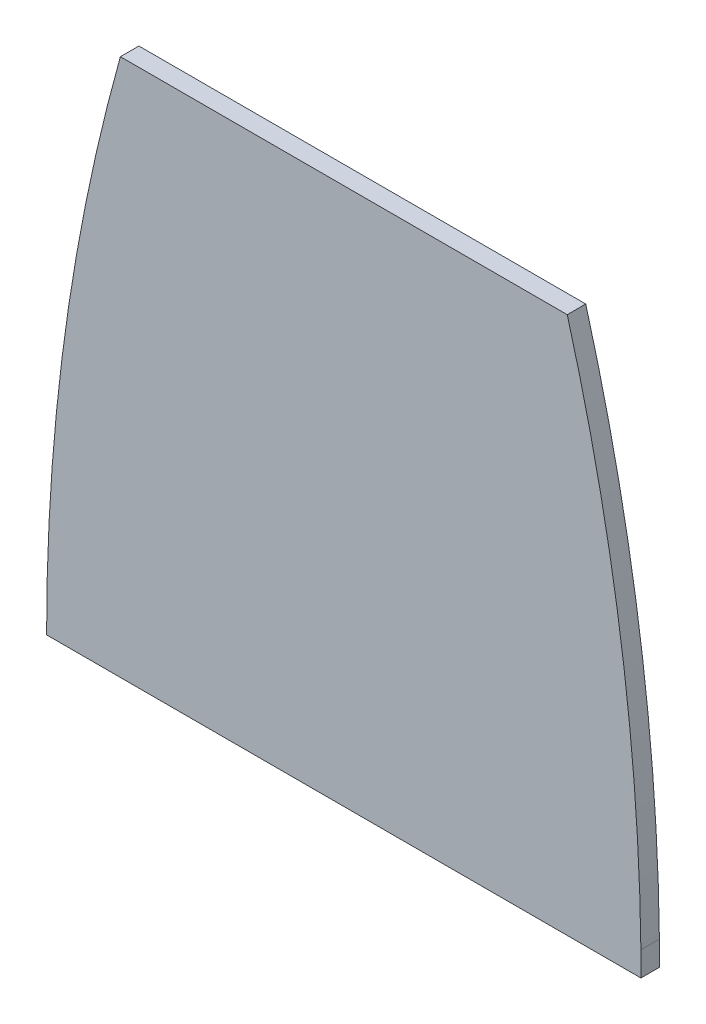
ISO-10303-21;
HEADER;
FILE_DESCRIPTION(('STEP AP214'),'2;1');
FILE_NAME('part.step','',(''),(''),'','','');
FILE_SCHEMA(('AUTOMOTIVE_DESIGN { 1 0 10303 214 1 1 1 1 }'));
ENDSEC;
DATA;
#1=APPLICATION_CONTEXT('core data for automotive mechanical design processes');
#2=APPLICATION_PROTOCOL_DEFINITION('international standard','automotive_design',2000,#1);
#3=PRODUCT_CONTEXT('',#1,'mechanical');
#4=PRODUCT('Part','Part','',(#3));
#5=PRODUCT_RELATED_PRODUCT_CATEGORY('part','',(#4));
#6=PRODUCT_DEFINITION_FORMATION('','',#4);
#7=PRODUCT_DEFINITION_CONTEXT('part definition',#1,'design');
#8=PRODUCT_DEFINITION('design','',#6,#7);
#9=PRODUCT_DEFINITION_SHAPE('','',#8);
#10=(LENGTH_UNIT() NAMED_UNIT(*) SI_UNIT(.MILLI.,.METRE.));
#11=(NAMED_UNIT(*) PLANE_ANGLE_UNIT() SI_UNIT($,.RADIAN.));
#12=(NAMED_UNIT(*) SI_UNIT($,.STERADIAN.) SOLID_ANGLE_UNIT());
#13=UNCERTAINTY_MEASURE_WITH_UNIT(LENGTH_MEASURE(1.E-05),#10,'distance_accuracy_value','');
#14=(GEOMETRIC_REPRESENTATION_CONTEXT(3) GLOBAL_UNCERTAINTY_ASSIGNED_CONTEXT((#13)) GLOBAL_UNIT_ASSIGNED_CONTEXT((#10,
#11,#12)) REPRESENTATION_CONTEXT('',''));
#15=CARTESIAN_POINT('',(0.,0.,0.));
#16=DIRECTION('',(0.,0.,1.));
#17=DIRECTION('',(1.,0.,0.));
#18=AXIS2_PLACEMENT_3D('',#15,#16,#17);
#19=CARTESIAN_POINT('',(275.39518676895,-43.5927780283153,3.));
#20=DIRECTION('',(0.,0.,-1.));
#21=DIRECTION('',(-1.,0.,0.));
#22=AXIS2_PLACEMENT_3D('',#19,#20,#21);
#23=CYLINDRICAL_SURFACE('',#22,323.583050847467);
#24=CARTESIAN_POINT('',(275.39518676895,-43.5927780283153,0.));
#25=DIRECTION('',(0.,0.,1.));
#26=DIRECTION('',(1.,0.,0.));
#27=AXIS2_PLACEMENT_3D('',#24,#25,#26);
#28=CIRCLE('',#27,323.583050847467);
#29=CARTESIAN_POINT('',(-36.2210349058072,43.5927780283133,0.));
#30=VERTEX_POINT('',#29);
#31=CARTESIAN_POINT('',(-48.187864078518,-43.5927780283133,0.));
#32=VERTEX_POINT('',#31);
#33=EDGE_CURVE('E123',#30,#32,#28,.T.);
#34=ORIENTED_EDGE('',*,*,#33,.T.);
#35=DIRECTION('',(0.,0.,-1.));
#36=VECTOR('',#35,1.);
#37=CARTESIAN_POINT('',(-48.187864078518,-43.5927780283133,3.));
#38=LINE('',#37,#36);
#39=CARTESIAN_POINT('',(-48.187864078518,-43.5927780283133,3.));
#40=VERTEX_POINT('',#39);
#41=EDGE_CURVE('E11',#40,#32,#38,.T.);
#42=ORIENTED_EDGE('',*,*,#41,.F.);
#43=CARTESIAN_POINT('',(275.39518676895,-43.5927780283153,3.));
#44=DIRECTION('',(0.,0.,1.));
#45=DIRECTION('',(1.,0.,0.));
#46=AXIS2_PLACEMENT_3D('',#43,#44,#45);
#47=CIRCLE('',#46,323.583050847467);
#48=CARTESIAN_POINT('',(-36.2210349058072,43.5927780283133,3.));
#49=VERTEX_POINT('',#48);
#50=EDGE_CURVE('E138',#49,#40,#47,.T.);
#51=ORIENTED_EDGE('',*,*,#50,.F.);
#52=DIRECTION('',(0.,0.,-1.));
#53=VECTOR('',#52,1.);
#54=CARTESIAN_POINT('',(-36.2210349058072,43.5927780283133,3.));
#55=LINE('',#54,#53);
#56=EDGE_CURVE('E60',#49,#30,#55,.T.);
#57=ORIENTED_EDGE('',*,*,#56,.T.);
#58=EDGE_LOOP('',(#34,#42,#51,#57));
#59=FACE_BOUND('',#58,.T.);
#60=ADVANCED_FACE('F43',(#59),#23,.T.);
#61=CARTESIAN_POINT('',(-48.187864078518,-43.5927780283133,3.));
#62=DIRECTION('',(0.,1.,0.));
#63=DIRECTION('',(0.,0.,1.));
#64=AXIS2_PLACEMENT_3D('',#61,#62,#63);
#65=PLANE('',#64);
#66=DIRECTION('',(1.,0.,0.));
#67=VECTOR('',#66,1.);
#68=CARTESIAN_POINT('',(-48.187864078518,-43.5927780283133,0.));
#69=LINE('',#68,#67);
#70=CARTESIAN_POINT('',(48.187864078518,-43.5927780283133,0.));
#71=VERTEX_POINT('',#70);
#72=EDGE_CURVE('E126',#32,#71,#69,.T.);
#73=ORIENTED_EDGE('',*,*,#72,.T.);
#74=DIRECTION('',(0.,0.,-1.));
#75=VECTOR('',#74,1.);
#76=CARTESIAN_POINT('',(48.187864078518,-43.5927780283133,3.));
#77=LINE('',#76,#75);
#78=CARTESIAN_POINT('',(48.187864078518,-43.5927780283133,3.));
#79=VERTEX_POINT('',#78);
#80=EDGE_CURVE('E52',#79,#71,#77,.T.);
#81=ORIENTED_EDGE('',*,*,#80,.F.);
#82=DIRECTION('',(1.,0.,0.));
#83=VECTOR('',#82,1.);
#84=CARTESIAN_POINT('',(-48.187864078518,-43.5927780283133,3.));
#85=LINE('',#84,#83);
#86=EDGE_CURVE('E90',#40,#79,#85,.T.);
#87=ORIENTED_EDGE('',*,*,#86,.F.);
#88=ORIENTED_EDGE('',*,*,#41,.T.);
#89=EDGE_LOOP('',(#73,#81,#87,#88));
#90=FACE_BOUND('',#89,.T.);
#91=ADVANCED_FACE('F156',(#90),#65,.F.);
#92=CARTESIAN_POINT('',(48.187864078518,-43.5927780283133,3.));
#93=DIRECTION('',(-1.,0.,0.));
#94=DIRECTION('',(0.,0.,1.));
#95=AXIS2_PLACEMENT_3D('',#92,#93,#94);
#96=PLANE('',#95);
#97=DIRECTION('',(0.,1.,0.));
#98=VECTOR('',#97,1.);
#99=CARTESIAN_POINT('',(48.187864078518,-43.5927780283133,0.));
#100=LINE('',#99,#98);
#101=CARTESIAN_POINT('',(48.187864078518,-39.6295312697225,0.));
#102=VERTEX_POINT('',#101);
#103=EDGE_CURVE('E110',#71,#102,#100,.T.);
#104=ORIENTED_EDGE('',*,*,#103,.T.);
#105=DIRECTION('',(0.,0.,-1.));
#106=VECTOR('',#105,1.);
#107=CARTESIAN_POINT('',(48.187864078518,-39.6295312697225,3.));
#108=LINE('',#107,#106);
#109=CARTESIAN_POINT('',(48.187864078518,-39.6295312697225,3.));
#110=VERTEX_POINT('',#109);
#111=EDGE_CURVE('E107',#110,#102,#108,.T.);
#112=ORIENTED_EDGE('',*,*,#111,.F.);
#113=DIRECTION('',(0.,1.,0.));
#114=VECTOR('',#113,1.);
#115=CARTESIAN_POINT('',(48.187864078518,-43.5927780283133,3.));
#116=LINE('',#115,#114);
#117=EDGE_CURVE('E96',#79,#110,#116,.T.);
#118=ORIENTED_EDGE('',*,*,#117,.F.);
#119=ORIENTED_EDGE('',*,*,#80,.T.);
#120=EDGE_LOOP('',(#104,#112,#118,#119));
#121=FACE_BOUND('',#120,.T.);
#122=ADVANCED_FACE('F108',(#121),#96,.F.);
#123=CARTESIAN_POINT('',(-275.370914925985,-43.5927780283153,3.));
#124=DIRECTION('',(0.,0.,-1.));
#125=DIRECTION('',(-1.,0.,0.));
#126=AXIS2_PLACEMENT_3D('',#123,#124,#125);
#127=CYLINDRICAL_SURFACE('',#126,323.583050847467);
#128=CARTESIAN_POINT('',(-275.370914925985,-43.5927780283153,0.));
#129=DIRECTION('',(0.,0.,1.));
#130=DIRECTION('',(1.,0.,0.));
#131=AXIS2_PLACEMENT_3D('',#128,#129,#130);
#132=CIRCLE('',#131,323.583050847467);
#133=CARTESIAN_POINT('',(36.2453067487712,43.5927780283133,0.));
#134=VERTEX_POINT('',#133);
#135=EDGE_CURVE('E131',#102,#134,#132,.T.);
#136=ORIENTED_EDGE('',*,*,#135,.T.);
#137=DIRECTION('',(0.,0.,-1.));
#138=VECTOR('',#137,1.);
#139=CARTESIAN_POINT('',(36.2453067487712,43.5927780283133,3.));
#140=LINE('',#139,#138);
#141=CARTESIAN_POINT('',(36.2453067487712,43.5927780283133,3.));
#142=VERTEX_POINT('',#141);
#143=EDGE_CURVE('E78',#142,#134,#140,.T.);
#144=ORIENTED_EDGE('',*,*,#143,.F.);
#145=CARTESIAN_POINT('',(-275.370914925985,-43.5927780283153,3.));
#146=DIRECTION('',(0.,0.,1.));
#147=DIRECTION('',(1.,0.,0.));
#148=AXIS2_PLACEMENT_3D('',#145,#146,#147);
#149=CIRCLE('',#148,323.583050847467);
#150=EDGE_CURVE('E101',#110,#142,#149,.T.);
#151=ORIENTED_EDGE('',*,*,#150,.F.);
#152=ORIENTED_EDGE('',*,*,#111,.T.);
#153=EDGE_LOOP('',(#136,#144,#151,#152));
#154=FACE_BOUND('',#153,.T.);
#155=ADVANCED_FACE('F115',(#154),#127,.T.);
#156=CARTESIAN_POINT('',(-36.2210349058072,43.5927780283133,3.));
#157=DIRECTION('',(0.,1.,0.));
#158=DIRECTION('',(0.,0.,1.));
#159=AXIS2_PLACEMENT_3D('',#156,#157,#158);
#160=PLANE('',#159);
#161=DIRECTION('',(1.,0.,0.));
#162=VECTOR('',#161,1.);
#163=CARTESIAN_POINT('',(-36.2210349058072,43.5927780283133,0.));
#164=LINE('',#163,#162);
#165=EDGE_CURVE('E134',#30,#134,#164,.T.);
#166=ORIENTED_EDGE('',*,*,#165,.F.);
#167=ORIENTED_EDGE('',*,*,#56,.F.);
#168=DIRECTION('',(1.,0.,0.));
#169=VECTOR('',#168,1.);
#170=CARTESIAN_POINT('',(-36.2210349058072,43.5927780283133,3.));
#171=LINE('',#170,#169);
#172=EDGE_CURVE('E117',#49,#142,#171,.T.);
#173=ORIENTED_EDGE('',*,*,#172,.T.);
#174=ORIENTED_EDGE('',*,*,#143,.T.);
#175=EDGE_LOOP('',(#166,#167,#173,#174));
#176=FACE_BOUND('',#175,.T.);
#177=ADVANCED_FACE('F145',(#176),#160,.T.);
#178=CARTESIAN_POINT('',(275.39518676895,-43.5927780283153,3.));
#179=DIRECTION('',(0.,0.,1.));
#180=DIRECTION('',(1.,0.,0.));
#181=AXIS2_PLACEMENT_3D('',#178,#179,#180);
#182=PLANE('',#181);
#183=ORIENTED_EDGE('',*,*,#50,.T.);
#184=ORIENTED_EDGE('',*,*,#86,.T.);
#185=ORIENTED_EDGE('',*,*,#117,.T.);
#186=ORIENTED_EDGE('',*,*,#150,.T.);
#187=ORIENTED_EDGE('',*,*,#172,.F.);
#188=EDGE_LOOP('',(#183,#184,#185,#186,#187));
#189=FACE_BOUND('',#188,.T.);
#190=ADVANCED_FACE('F98',(#189),#182,.T.);
#191=CARTESIAN_POINT('',(275.39518676895,-43.5927780283153,0.));
#192=DIRECTION('',(0.,0.,1.));
#193=DIRECTION('',(1.,0.,0.));
#194=AXIS2_PLACEMENT_3D('',#191,#192,#193);
#195=PLANE('',#194);
#196=ORIENTED_EDGE('',*,*,#33,.F.);
#197=ORIENTED_EDGE('',*,*,#165,.T.);
#198=ORIENTED_EDGE('',*,*,#135,.F.);
#199=ORIENTED_EDGE('',*,*,#103,.F.);
#200=ORIENTED_EDGE('',*,*,#72,.F.);
#201=EDGE_LOOP('',(#196,#197,#198,#199,#200));
#202=FACE_BOUND('',#201,.T.);
#203=ADVANCED_FACE('F144',(#202),#195,.F.);
#204=CLOSED_SHELL('',(#60,#91,#122,#155,#177,#190,#203));
#205=MANIFOLD_SOLID_BREP('B2',#204);
#206=ADVANCED_BREP_SHAPE_REPRESENTATION('',(#18,#205),#14);
#207=SHAPE_DEFINITION_REPRESENTATION(#9,#206);
ENDSEC;
END-ISO-10303-21;
